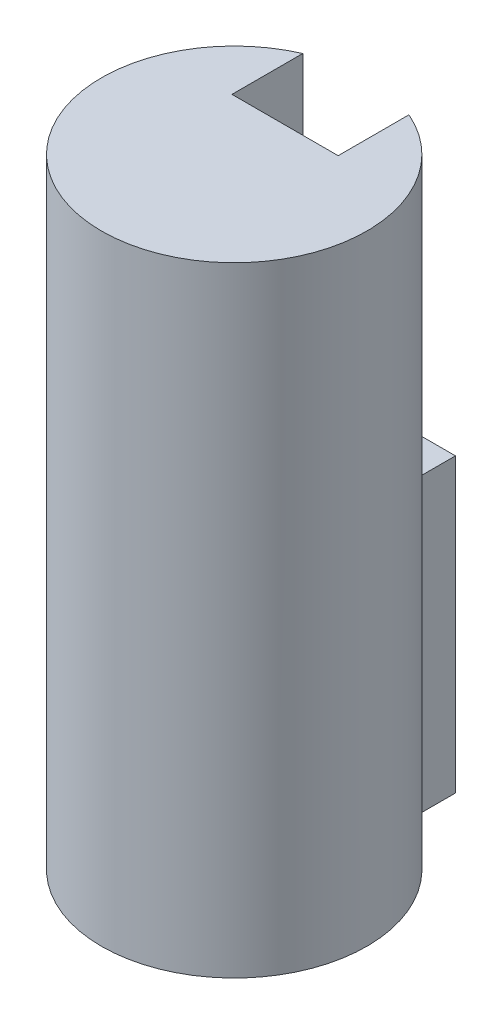
ISO-10303-21;
HEADER;
FILE_DESCRIPTION(('STEP AP214'),'2;1');
FILE_NAME('part.step','',(''),(''),'','','');
FILE_SCHEMA(('AUTOMOTIVE_DESIGN { 1 0 10303 214 1 1 1 1 }'));
ENDSEC;
DATA;
#1=APPLICATION_CONTEXT('core data for automotive mechanical design processes');
#2=APPLICATION_PROTOCOL_DEFINITION('international standard','automotive_design',2000,#1);
#3=PRODUCT_CONTEXT('',#1,'mechanical');
#4=PRODUCT('Part','Part','',(#3));
#5=PRODUCT_RELATED_PRODUCT_CATEGORY('part','',(#4));
#6=PRODUCT_DEFINITION_FORMATION('','',#4);
#7=PRODUCT_DEFINITION_CONTEXT('part definition',#1,'design');
#8=PRODUCT_DEFINITION('design','',#6,#7);
#9=PRODUCT_DEFINITION_SHAPE('','',#8);
#10=(LENGTH_UNIT() NAMED_UNIT(*) SI_UNIT(.MILLI.,.METRE.));
#11=(NAMED_UNIT(*) PLANE_ANGLE_UNIT() SI_UNIT($,.RADIAN.));
#12=(NAMED_UNIT(*) SI_UNIT($,.STERADIAN.) SOLID_ANGLE_UNIT());
#13=UNCERTAINTY_MEASURE_WITH_UNIT(LENGTH_MEASURE(1.E-05),#10,'distance_accuracy_value','');
#14=(GEOMETRIC_REPRESENTATION_CONTEXT(3) GLOBAL_UNCERTAINTY_ASSIGNED_CONTEXT((#13)) GLOBAL_UNIT_ASSIGNED_CONTEXT((#10,
#11,#12)) REPRESENTATION_CONTEXT('',''));
#15=CARTESIAN_POINT('',(0.,0.,0.));
#16=DIRECTION('',(0.,0.,1.));
#17=DIRECTION('',(1.,0.,0.));
#18=AXIS2_PLACEMENT_3D('',#15,#16,#17);
#19=CARTESIAN_POINT('',(0.,14.,0.));
#20=DIRECTION('',(0.,-1.,0.));
#21=DIRECTION('',(0.,0.,-1.));
#22=AXIS2_PLACEMENT_3D('',#19,#20,#21);
#23=CYLINDRICAL_SURFACE('',#22,3.);
#24=CARTESIAN_POINT('',(0.,14.,0.));
#25=DIRECTION('',(0.,1.,0.));
#26=DIRECTION('',(0.,0.,1.));
#27=AXIS2_PLACEMENT_3D('',#24,#25,#26);
#28=CIRCLE('',#27,3.);
#29=CARTESIAN_POINT('',(-1.2,14.,-2.7495454169735));
#30=VERTEX_POINT('',#29);
#31=CARTESIAN_POINT('',(1.2,14.,-2.7495454169735));
#32=VERTEX_POINT('',#31);
#33=EDGE_CURVE('E42',#30,#32,#28,.T.);
#34=ORIENTED_EDGE('',*,*,#33,.F.);
#35=DIRECTION('',(0.,1.,0.));
#36=VECTOR('',#35,1.);
#37=CARTESIAN_POINT('',(-1.2,10.,-2.7495454169735));
#38=LINE('',#37,#36);
#39=CARTESIAN_POINT('',(-1.2,10.,-2.7495454169735));
#40=VERTEX_POINT('',#39);
#41=EDGE_CURVE('E126',#40,#30,#38,.T.);
#42=ORIENTED_EDGE('',*,*,#41,.F.);
#43=CARTESIAN_POINT('',(0.,10.,0.));
#44=DIRECTION('',(0.,-1.,0.));
#45=DIRECTION('',(0.,0.,-1.));
#46=AXIS2_PLACEMENT_3D('',#43,#44,#45);
#47=CIRCLE('',#46,3.);
#48=CARTESIAN_POINT('',(1.2,10.,-2.7495454169735));
#49=VERTEX_POINT('',#48);
#50=EDGE_CURVE('E11',#40,#49,#47,.T.);
#51=ORIENTED_EDGE('',*,*,#50,.T.);
#52=DIRECTION('',(0.,1.,0.));
#53=VECTOR('',#52,1.);
#54=CARTESIAN_POINT('',(1.2,10.,-2.7495454169735));
#55=LINE('',#54,#53);
#56=EDGE_CURVE('E129',#49,#32,#55,.T.);
#57=ORIENTED_EDGE('',*,*,#56,.T.);
#58=EDGE_LOOP('',(#34,#42,#51,#57));
#59=FACE_BOUND('',#58,.T.);
#60=CARTESIAN_POINT('',(0.,0.,0.));
#61=DIRECTION('',(0.,1.,0.));
#62=DIRECTION('',(0.,0.,1.));
#63=AXIS2_PLACEMENT_3D('',#60,#61,#62);
#64=CIRCLE('',#63,3.);
#65=CARTESIAN_POINT('',(-1.,0.,-2.82842712474619));
#66=VERTEX_POINT('',#65);
#67=CARTESIAN_POINT('',(1.,0.,-2.82842712474619));
#68=VERTEX_POINT('',#67);
#69=EDGE_CURVE('E160',#66,#68,#64,.T.);
#70=ORIENTED_EDGE('',*,*,#69,.T.);
#71=DIRECTION('',(0.,-1.,0.));
#72=VECTOR('',#71,1.);
#73=CARTESIAN_POINT('',(1.,6.6,-2.82842712474619));
#74=LINE('',#73,#72);
#75=CARTESIAN_POINT('',(1.,6.6,-2.82842712474619));
#76=VERTEX_POINT('',#75);
#77=EDGE_CURVE('E157',#76,#68,#74,.T.);
#78=ORIENTED_EDGE('',*,*,#77,.F.);
#79=CARTESIAN_POINT('',(0.,6.6,0.));
#80=DIRECTION('',(0.,1.,0.));
#81=DIRECTION('',(0.,0.,1.));
#82=AXIS2_PLACEMENT_3D('',#79,#80,#81);
#83=CIRCLE('',#82,3.);
#84=CARTESIAN_POINT('',(-1.,6.6,-2.82842712474619));
#85=VERTEX_POINT('',#84);
#86=EDGE_CURVE('E57',#76,#85,#83,.T.);
#87=ORIENTED_EDGE('',*,*,#86,.T.);
#88=DIRECTION('',(0.,-1.,0.));
#89=VECTOR('',#88,1.);
#90=CARTESIAN_POINT('',(-1.,6.6,-2.82842712474619));
#91=LINE('',#90,#89);
#92=EDGE_CURVE('E144',#85,#66,#91,.T.);
#93=ORIENTED_EDGE('',*,*,#92,.T.);
#94=EDGE_LOOP('',(#70,#78,#87,#93));
#95=FACE_BOUND('',#94,.T.);
#96=ADVANCED_FACE('F35',(#59,#95),#23,.T.);
#97=CARTESIAN_POINT('',(0.,14.,0.));
#98=DIRECTION('',(0.,1.,0.));
#99=DIRECTION('',(0.,0.,1.));
#100=AXIS2_PLACEMENT_3D('',#97,#98,#99);
#101=PLANE('',#100);
#102=DIRECTION('',(0.,0.,1.));
#103=VECTOR('',#102,1.);
#104=CARTESIAN_POINT('',(-1.2,14.,-1.1495454169735));
#105=LINE('',#104,#103);
#106=CARTESIAN_POINT('',(-1.2,14.,-1.1495454169735));
#107=VERTEX_POINT('',#106);
#108=EDGE_CURVE('E49',#30,#107,#105,.T.);
#109=ORIENTED_EDGE('',*,*,#108,.F.);
#110=ORIENTED_EDGE('',*,*,#33,.T.);
#111=DIRECTION('',(0.,0.,-1.));
#112=VECTOR('',#111,1.);
#113=CARTESIAN_POINT('',(1.2,14.,-1.1495454169735));
#114=LINE('',#113,#112);
#115=CARTESIAN_POINT('',(1.2,14.,-1.1495454169735));
#116=VERTEX_POINT('',#115);
#117=EDGE_CURVE('E118',#116,#32,#114,.T.);
#118=ORIENTED_EDGE('',*,*,#117,.F.);
#119=DIRECTION('',(1.,0.,0.));
#120=VECTOR('',#119,1.);
#121=CARTESIAN_POINT('',(-1.2,14.,-1.1495454169735));
#122=LINE('',#121,#120);
#123=EDGE_CURVE('E120',#107,#116,#122,.T.);
#124=ORIENTED_EDGE('',*,*,#123,.F.);
#125=EDGE_LOOP('',(#109,#110,#118,#124));
#126=FACE_BOUND('',#125,.T.);
#127=ADVANCED_FACE('F187',(#126),#101,.T.);
#128=CARTESIAN_POINT('',(0.,0.,0.));
#129=DIRECTION('',(0.,1.,0.));
#130=DIRECTION('',(0.,0.,1.));
#131=AXIS2_PLACEMENT_3D('',#128,#129,#130);
#132=PLANE('',#131);
#133=ORIENTED_EDGE('',*,*,#69,.F.);
#134=DIRECTION('',(0.,0.,-1.));
#135=VECTOR('',#134,1.);
#136=CARTESIAN_POINT('',(-1.,0.,0.));
#137=LINE('',#136,#135);
#138=CARTESIAN_POINT('',(-1.,0.,-4.));
#139=VERTEX_POINT('',#138);
#140=EDGE_CURVE('E135',#66,#139,#137,.T.);
#141=ORIENTED_EDGE('',*,*,#140,.T.);
#142=DIRECTION('',(1.,0.,0.));
#143=VECTOR('',#142,1.);
#144=CARTESIAN_POINT('',(0.,0.,-4.));
#145=LINE('',#144,#143);
#146=CARTESIAN_POINT('',(1.,0.,-4.));
#147=VERTEX_POINT('',#146);
#148=EDGE_CURVE('E147',#139,#147,#145,.T.);
#149=ORIENTED_EDGE('',*,*,#148,.T.);
#150=DIRECTION('',(0.,0.,1.));
#151=VECTOR('',#150,1.);
#152=CARTESIAN_POINT('',(0.999999999999999,0.,0.));
#153=LINE('',#152,#151);
#154=EDGE_CURVE('E128',#147,#68,#153,.T.);
#155=ORIENTED_EDGE('',*,*,#154,.T.);
#156=EDGE_LOOP('',(#133,#141,#149,#155));
#157=FACE_BOUND('',#156,.T.);
#158=ADVANCED_FACE('F168',(#157),#132,.F.);
#159=CARTESIAN_POINT('',(0.999999999999999,6.6,0.));
#160=DIRECTION('',(1.,0.,0.));
#161=DIRECTION('',(0.,0.,-1.));
#162=AXIS2_PLACEMENT_3D('',#159,#160,#161);
#163=PLANE('',#162);
#164=ORIENTED_EDGE('',*,*,#154,.F.);
#165=DIRECTION('',(0.,-1.,0.));
#166=VECTOR('',#165,1.);
#167=CARTESIAN_POINT('',(1.,6.6,-4.));
#168=LINE('',#167,#166);
#169=CARTESIAN_POINT('',(1.,6.6,-4.));
#170=VERTEX_POINT('',#169);
#171=EDGE_CURVE('E155',#170,#147,#168,.T.);
#172=ORIENTED_EDGE('',*,*,#171,.F.);
#173=DIRECTION('',(0.,0.,1.));
#174=VECTOR('',#173,1.);
#175=CARTESIAN_POINT('',(0.999999999999999,6.6,0.));
#176=LINE('',#175,#174);
#177=EDGE_CURVE('E134',#170,#76,#176,.T.);
#178=ORIENTED_EDGE('',*,*,#177,.T.);
#179=ORIENTED_EDGE('',*,*,#77,.T.);
#180=EDGE_LOOP('',(#164,#172,#178,#179));
#181=FACE_BOUND('',#180,.T.);
#182=ADVANCED_FACE('F166',(#181),#163,.T.);
#183=CARTESIAN_POINT('',(0.,6.6,-4.));
#184=DIRECTION('',(0.,0.,-1.));
#185=DIRECTION('',(-1.,0.,0.));
#186=AXIS2_PLACEMENT_3D('',#183,#184,#185);
#187=PLANE('',#186);
#188=ORIENTED_EDGE('',*,*,#148,.F.);
#189=DIRECTION('',(0.,-1.,0.));
#190=VECTOR('',#189,1.);
#191=CARTESIAN_POINT('',(-1.,6.6,-4.));
#192=LINE('',#191,#190);
#193=CARTESIAN_POINT('',(-1.,6.6,-4.));
#194=VERTEX_POINT('',#193);
#195=EDGE_CURVE('E153',#194,#139,#192,.T.);
#196=ORIENTED_EDGE('',*,*,#195,.F.);
#197=DIRECTION('',(1.,0.,0.));
#198=VECTOR('',#197,1.);
#199=CARTESIAN_POINT('',(0.,6.6,-4.));
#200=LINE('',#199,#198);
#201=EDGE_CURVE('E138',#194,#170,#200,.T.);
#202=ORIENTED_EDGE('',*,*,#201,.T.);
#203=ORIENTED_EDGE('',*,*,#171,.T.);
#204=EDGE_LOOP('',(#188,#196,#202,#203));
#205=FACE_BOUND('',#204,.T.);
#206=ADVANCED_FACE('F171',(#205),#187,.T.);
#207=CARTESIAN_POINT('',(-1.,6.6,0.));
#208=DIRECTION('',(-1.,0.,0.));
#209=DIRECTION('',(0.,0.,1.));
#210=AXIS2_PLACEMENT_3D('',#207,#208,#209);
#211=PLANE('',#210);
#212=ORIENTED_EDGE('',*,*,#140,.F.);
#213=ORIENTED_EDGE('',*,*,#92,.F.);
#214=DIRECTION('',(0.,0.,-1.));
#215=VECTOR('',#214,1.);
#216=CARTESIAN_POINT('',(-1.,6.6,0.));
#217=LINE('',#216,#215);
#218=EDGE_CURVE('E141',#85,#194,#217,.T.);
#219=ORIENTED_EDGE('',*,*,#218,.T.);
#220=ORIENTED_EDGE('',*,*,#195,.T.);
#221=EDGE_LOOP('',(#212,#213,#219,#220));
#222=FACE_BOUND('',#221,.T.);
#223=ADVANCED_FACE('F177',(#222),#211,.T.);
#224=CARTESIAN_POINT('',(0.,6.6,0.));
#225=DIRECTION('',(0.,1.,0.));
#226=DIRECTION('',(0.,0.,1.));
#227=AXIS2_PLACEMENT_3D('',#224,#225,#226);
#228=PLANE('',#227);
#229=ORIENTED_EDGE('',*,*,#86,.F.);
#230=ORIENTED_EDGE('',*,*,#177,.F.);
#231=ORIENTED_EDGE('',*,*,#201,.F.);
#232=ORIENTED_EDGE('',*,*,#218,.F.);
#233=EDGE_LOOP('',(#229,#230,#231,#232));
#234=FACE_BOUND('',#233,.T.);
#235=ADVANCED_FACE('F174',(#234),#228,.T.);
#236=CARTESIAN_POINT('',(0.,10.,0.));
#237=DIRECTION('',(0.,-1.,0.));
#238=DIRECTION('',(0.,0.,-1.));
#239=AXIS2_PLACEMENT_3D('',#236,#237,#238);
#240=PLANE('',#239);
#241=DIRECTION('',(0.,0.,1.));
#242=VECTOR('',#241,1.);
#243=CARTESIAN_POINT('',(-1.2,10.,-1.1495454169735));
#244=LINE('',#243,#242);
#245=CARTESIAN_POINT('',(-1.2,10.,-1.1495454169735));
#246=VERTEX_POINT('',#245);
#247=EDGE_CURVE('E102',#40,#246,#244,.T.);
#248=ORIENTED_EDGE('',*,*,#247,.T.);
#249=DIRECTION('',(1.,0.,0.));
#250=VECTOR('',#249,1.);
#251=CARTESIAN_POINT('',(-1.2,10.,-1.1495454169735));
#252=LINE('',#251,#250);
#253=CARTESIAN_POINT('',(1.2,10.,-1.1495454169735));
#254=VERTEX_POINT('',#253);
#255=EDGE_CURVE('E111',#246,#254,#252,.T.);
#256=ORIENTED_EDGE('',*,*,#255,.T.);
#257=DIRECTION('',(0.,0.,-1.));
#258=VECTOR('',#257,1.);
#259=CARTESIAN_POINT('',(1.2,10.,-1.1495454169735));
#260=LINE('',#259,#258);
#261=EDGE_CURVE('E108',#254,#49,#260,.T.);
#262=ORIENTED_EDGE('',*,*,#261,.T.);
#263=ORIENTED_EDGE('',*,*,#50,.F.);
#264=EDGE_LOOP('',(#248,#256,#262,#263));
#265=FACE_BOUND('',#264,.T.);
#266=ADVANCED_FACE('F117',(#265),#240,.F.);
#267=CARTESIAN_POINT('',(-1.2,10.,-1.1495454169735));
#268=DIRECTION('',(-1.,0.,0.));
#269=DIRECTION('',(0.,0.,1.));
#270=AXIS2_PLACEMENT_3D('',#267,#268,#269);
#271=PLANE('',#270);
#272=ORIENTED_EDGE('',*,*,#108,.T.);
#273=DIRECTION('',(0.,1.,0.));
#274=VECTOR('',#273,1.);
#275=CARTESIAN_POINT('',(-1.2,10.,-1.1495454169735));
#276=LINE('',#275,#274);
#277=EDGE_CURVE('E98',#246,#107,#276,.T.);
#278=ORIENTED_EDGE('',*,*,#277,.F.);
#279=ORIENTED_EDGE('',*,*,#247,.F.);
#280=ORIENTED_EDGE('',*,*,#41,.T.);
#281=EDGE_LOOP('',(#272,#278,#279,#280));
#282=FACE_BOUND('',#281,.T.);
#283=ADVANCED_FACE('F100',(#282),#271,.F.);
#284=CARTESIAN_POINT('',(1.2,10.,-1.1495454169735));
#285=DIRECTION('',(1.,0.,0.));
#286=DIRECTION('',(0.,0.,-1.));
#287=AXIS2_PLACEMENT_3D('',#284,#285,#286);
#288=PLANE('',#287);
#289=ORIENTED_EDGE('',*,*,#117,.T.);
#290=ORIENTED_EDGE('',*,*,#56,.F.);
#291=ORIENTED_EDGE('',*,*,#261,.F.);
#292=DIRECTION('',(0.,1.,0.));
#293=VECTOR('',#292,1.);
#294=CARTESIAN_POINT('',(1.2,10.,-1.1495454169735));
#295=LINE('',#294,#293);
#296=EDGE_CURVE('E107',#254,#116,#295,.T.);
#297=ORIENTED_EDGE('',*,*,#296,.T.);
#298=EDGE_LOOP('',(#289,#290,#291,#297));
#299=FACE_BOUND('',#298,.T.);
#300=ADVANCED_FACE('F197',(#299),#288,.F.);
#301=CARTESIAN_POINT('',(-1.2,10.,-1.1495454169735));
#302=DIRECTION('',(0.,0.,1.));
#303=DIRECTION('',(1.,0.,0.));
#304=AXIS2_PLACEMENT_3D('',#301,#302,#303);
#305=PLANE('',#304);
#306=ORIENTED_EDGE('',*,*,#123,.T.);
#307=ORIENTED_EDGE('',*,*,#296,.F.);
#308=ORIENTED_EDGE('',*,*,#255,.F.);
#309=ORIENTED_EDGE('',*,*,#277,.T.);
#310=EDGE_LOOP('',(#306,#307,#308,#309));
#311=FACE_BOUND('',#310,.T.);
#312=ADVANCED_FACE('F112',(#311),#305,.F.);
#313=CLOSED_SHELL('',(#96,#127,#158,#182,#206,#223,#235,#266,#283,#300,#312));
#314=MANIFOLD_SOLID_BREP('B2',#313);
#315=ADVANCED_BREP_SHAPE_REPRESENTATION('',(#18,#314),#14);
#316=SHAPE_DEFINITION_REPRESENTATION(#9,#315);
ENDSEC;
END-ISO-10303-21;
